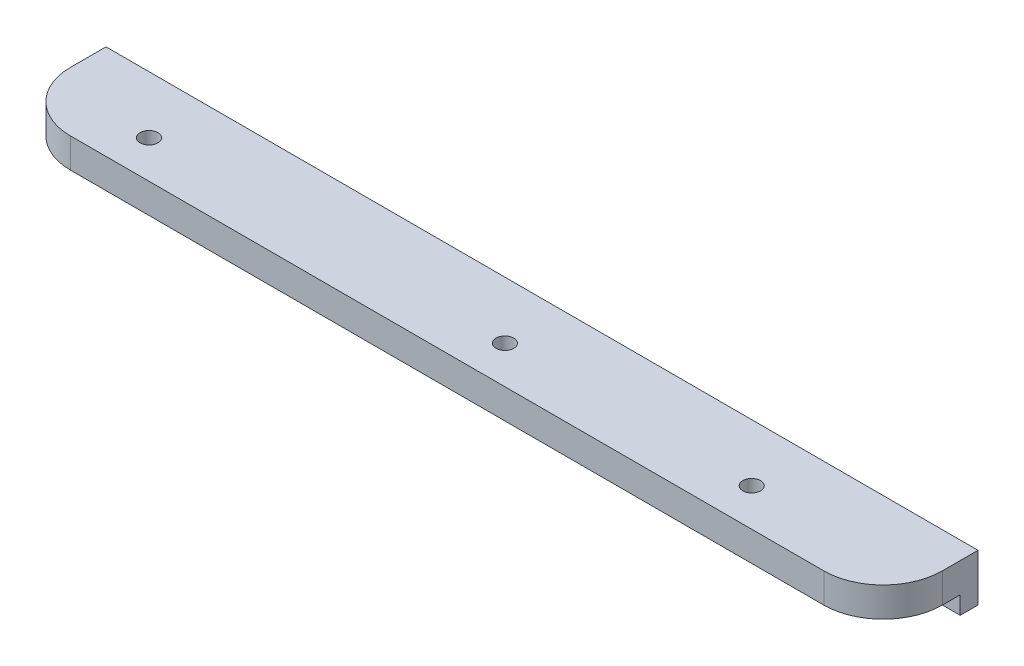
ISO-10303-21;
HEADER;
FILE_DESCRIPTION(('STEP AP214'),'2;1');
FILE_NAME('part.step','',(''),(''),'','','');
FILE_SCHEMA(('AUTOMOTIVE_DESIGN { 1 0 10303 214 1 1 1 1 }'));
ENDSEC;
DATA;
#1=APPLICATION_CONTEXT('core data for automotive mechanical design processes');
#2=APPLICATION_PROTOCOL_DEFINITION('international standard','automotive_design',2000,#1);
#3=PRODUCT_CONTEXT('',#1,'mechanical');
#4=PRODUCT('Part','Part','',(#3));
#5=PRODUCT_RELATED_PRODUCT_CATEGORY('part','',(#4));
#6=PRODUCT_DEFINITION_FORMATION('','',#4);
#7=PRODUCT_DEFINITION_CONTEXT('part definition',#1,'design');
#8=PRODUCT_DEFINITION('design','',#6,#7);
#9=PRODUCT_DEFINITION_SHAPE('','',#8);
#10=(LENGTH_UNIT() NAMED_UNIT(*) SI_UNIT(.MILLI.,.METRE.));
#11=(NAMED_UNIT(*) PLANE_ANGLE_UNIT() SI_UNIT($,.RADIAN.));
#12=(NAMED_UNIT(*) SI_UNIT($,.STERADIAN.) SOLID_ANGLE_UNIT());
#13=UNCERTAINTY_MEASURE_WITH_UNIT(LENGTH_MEASURE(1.E-05),#10,'distance_accuracy_value','');
#14=(GEOMETRIC_REPRESENTATION_CONTEXT(3) GLOBAL_UNCERTAINTY_ASSIGNED_CONTEXT((#13)) GLOBAL_UNIT_ASSIGNED_CONTEXT((#10,
#11,#12)) REPRESENTATION_CONTEXT('',''));
#15=CARTESIAN_POINT('',(0.,0.,0.));
#16=DIRECTION('',(0.,0.,1.));
#17=DIRECTION('',(1.,0.,0.));
#18=AXIS2_PLACEMENT_3D('',#15,#16,#17);
#19=CARTESIAN_POINT('',(-67.1671018276762,5.,0.));
#20=DIRECTION('',(1.,0.,0.));
#21=DIRECTION('',(0.,0.,-1.));
#22=AXIS2_PLACEMENT_3D('',#19,#20,#21);
#23=PLANE('',#22);
#24=DIRECTION('',(0.,0.,1.));
#25=VECTOR('',#24,1.);
#26=CARTESIAN_POINT('',(-67.1671018276762,0.,0.));
#27=LINE('',#26,#25);
#28=CARTESIAN_POINT('',(-67.1671018276762,0.,-27.2297650130548));
#29=VERTEX_POINT('',#28);
#30=CARTESIAN_POINT('',(-67.1671018276762,0.,-21.2297650130548));
#31=VERTEX_POINT('',#30);
#32=EDGE_CURVE('E173',#29,#31,#27,.T.);
#33=ORIENTED_EDGE('',*,*,#32,.F.);
#34=DIRECTION('',(0.,-1.,0.));
#35=VECTOR('',#34,1.);
#36=CARTESIAN_POINT('',(-67.1671018276762,8.,-27.2297650130548));
#37=LINE('',#36,#35);
#38=CARTESIAN_POINT('',(-67.1671018276762,-8.,-27.2297650130548));
#39=VERTEX_POINT('',#38);
#40=EDGE_CURVE('E128',#29,#39,#37,.T.);
#41=ORIENTED_EDGE('',*,*,#40,.T.);
#42=DIRECTION('',(0.,0.,1.));
#43=VECTOR('',#42,1.);
#44=CARTESIAN_POINT('',(-67.1671018276762,-8.,-24.2297650130548));
#45=LINE('',#44,#43);
#46=CARTESIAN_POINT('',(-67.1671018276762,-8.,-24.2297650130548));
#47=VERTEX_POINT('',#46);
#48=EDGE_CURVE('E154',#39,#47,#45,.T.);
#49=ORIENTED_EDGE('',*,*,#48,.T.);
#50=DIRECTION('',(0.,1.,0.));
#51=VECTOR('',#50,1.);
#52=CARTESIAN_POINT('',(-67.1671018276762,-8.,-24.2297650130548));
#53=LINE('',#52,#51);
#54=CARTESIAN_POINT('',(-67.1671018276762,-5.,-24.2297650130548));
#55=VERTEX_POINT('',#54);
#56=EDGE_CURVE('E148',#47,#55,#53,.T.);
#57=ORIENTED_EDGE('',*,*,#56,.T.);
#58=DIRECTION('',(0.,0.,1.));
#59=VECTOR('',#58,1.);
#60=CARTESIAN_POINT('',(-67.1671018276762,-5.,0.));
#61=LINE('',#60,#59);
#62=CARTESIAN_POINT('',(-67.1671018276762,-5.,-21.2297650130548));
#63=VERTEX_POINT('',#62);
#64=EDGE_CURVE('E134',#55,#63,#61,.T.);
#65=ORIENTED_EDGE('',*,*,#64,.T.);
#66=DIRECTION('',(0.,1.,0.));
#67=VECTOR('',#66,1.);
#68=CARTESIAN_POINT('',(-67.1671018276762,0.,-21.2297650130548));
#69=LINE('',#68,#67);
#70=EDGE_CURVE('E107',#63,#31,#69,.T.);
#71=ORIENTED_EDGE('',*,*,#70,.T.);
#72=EDGE_LOOP('',(#33,#41,#49,#57,#65,#71));
#73=FACE_BOUND('',#72,.T.);
#74=ADVANCED_FACE('F35',(#73),#23,.F.);
#75=CARTESIAN_POINT('',(0.,5.,-11.2297650130548));
#76=DIRECTION('',(0.,0.,1.));
#77=DIRECTION('',(1.,0.,0.));
#78=AXIS2_PLACEMENT_3D('',#75,#76,#77);
#79=PLANE('',#78);
#80=DIRECTION('',(0.,1.,0.));
#81=VECTOR('',#80,1.);
#82=CARTESIAN_POINT('',(69.8328981723238,5.,-11.2297650130548));
#83=LINE('',#82,#81);
#84=CARTESIAN_POINT('',(69.8328981723238,-5.,-11.2297650130548));
#85=VERTEX_POINT('',#84);
#86=CARTESIAN_POINT('',(69.8328981723238,0.,-11.2297650130548));
#87=VERTEX_POINT('',#86);
#88=EDGE_CURVE('E115',#85,#87,#83,.T.);
#89=ORIENTED_EDGE('',*,*,#88,.T.);
#90=DIRECTION('',(-1.,0.,0.));
#91=VECTOR('',#90,1.);
#92=CARTESIAN_POINT('',(0.,0.,-11.2297650130548));
#93=LINE('',#92,#91);
#94=CARTESIAN_POINT('',(-57.1671018276763,0.,-11.2297650130548));
#95=VERTEX_POINT('',#94);
#96=EDGE_CURVE('E103',#87,#95,#93,.T.);
#97=ORIENTED_EDGE('',*,*,#96,.T.);
#98=DIRECTION('',(0.,1.,0.));
#99=VECTOR('',#98,1.);
#100=CARTESIAN_POINT('',(-57.1671018276763,-5.,-11.2297650130548));
#101=LINE('',#100,#99);
#102=CARTESIAN_POINT('',(-57.1671018276763,-5.,-11.2297650130548));
#103=VERTEX_POINT('',#102);
#104=EDGE_CURVE('E120',#95,#103,#101,.F.);
#105=ORIENTED_EDGE('',*,*,#104,.T.);
#106=DIRECTION('',(-1.,0.,0.));
#107=VECTOR('',#106,1.);
#108=CARTESIAN_POINT('',(0.,-5.,-11.2297650130548));
#109=LINE('',#108,#107);
#110=EDGE_CURVE('E130',#85,#103,#109,.T.);
#111=ORIENTED_EDGE('',*,*,#110,.F.);
#112=EDGE_LOOP('',(#89,#97,#105,#111));
#113=FACE_BOUND('',#112,.T.);
#114=ADVANCED_FACE('F179',(#113),#79,.T.);
#115=CARTESIAN_POINT('',(79.8328981723237,5.,0.));
#116=DIRECTION('',(1.,0.,0.));
#117=DIRECTION('',(0.,0.,-1.));
#118=AXIS2_PLACEMENT_3D('',#115,#116,#117);
#119=PLANE('',#118);
#120=DIRECTION('',(0.,-1.,0.));
#121=VECTOR('',#120,1.);
#122=CARTESIAN_POINT('',(79.8328981723238,8.,-27.2297650130548));
#123=LINE('',#122,#121);
#124=CARTESIAN_POINT('',(79.8328981723238,0.,-27.2297650130548));
#125=VERTEX_POINT('',#124);
#126=CARTESIAN_POINT('',(79.8328981723238,-8.,-27.2297650130548));
#127=VERTEX_POINT('',#126);
#128=EDGE_CURVE('E113',#125,#127,#123,.T.);
#129=ORIENTED_EDGE('',*,*,#128,.F.);
#130=DIRECTION('',(0.,0.,1.));
#131=VECTOR('',#130,1.);
#132=CARTESIAN_POINT('',(79.8328981723237,0.,0.));
#133=LINE('',#132,#131);
#134=CARTESIAN_POINT('',(79.8328981723238,0.,-21.2297650130548));
#135=VERTEX_POINT('',#134);
#136=EDGE_CURVE('E100',#125,#135,#133,.T.);
#137=ORIENTED_EDGE('',*,*,#136,.T.);
#138=DIRECTION('',(0.,1.,0.));
#139=VECTOR('',#138,1.);
#140=CARTESIAN_POINT('',(79.8328981723238,5.,-21.2297650130548));
#141=LINE('',#140,#139);
#142=CARTESIAN_POINT('',(79.8328981723238,-5.,-21.2297650130548));
#143=VERTEX_POINT('',#142);
#144=EDGE_CURVE('E43',#135,#143,#141,.F.);
#145=ORIENTED_EDGE('',*,*,#144,.T.);
#146=DIRECTION('',(0.,0.,1.));
#147=VECTOR('',#146,1.);
#148=CARTESIAN_POINT('',(79.8328981723237,-5.,0.));
#149=LINE('',#148,#147);
#150=CARTESIAN_POINT('',(79.8328981723238,-5.,-24.2297650130548));
#151=VERTEX_POINT('',#150);
#152=EDGE_CURVE('E132',#151,#143,#149,.T.);
#153=ORIENTED_EDGE('',*,*,#152,.F.);
#154=DIRECTION('',(0.,1.,0.));
#155=VECTOR('',#154,1.);
#156=CARTESIAN_POINT('',(79.8328981723238,-8.,-24.2297650130548));
#157=LINE('',#156,#155);
#158=CARTESIAN_POINT('',(79.8328981723238,-8.,-24.2297650130548));
#159=VERTEX_POINT('',#158);
#160=EDGE_CURVE('E146',#159,#151,#157,.T.);
#161=ORIENTED_EDGE('',*,*,#160,.F.);
#162=DIRECTION('',(0.,0.,-1.));
#163=VECTOR('',#162,1.);
#164=CARTESIAN_POINT('',(79.8328981723238,-8.,-24.2297650130548));
#165=LINE('',#164,#163);
#166=EDGE_CURVE('E158',#159,#127,#165,.T.);
#167=ORIENTED_EDGE('',*,*,#166,.T.);
#168=EDGE_LOOP('',(#129,#137,#145,#153,#161,#167));
#169=FACE_BOUND('',#168,.T.);
#170=ADVANCED_FACE('F111',(#169),#119,.T.);
#171=CARTESIAN_POINT('',(51.3328981723237,5.,-17.5797650130548));
#172=DIRECTION('',(0.,-1.,0.));
#173=DIRECTION('',(0.,0.,-1.));
#174=AXIS2_PLACEMENT_3D('',#171,#172,#173);
#175=CYLINDRICAL_SURFACE('',#174,1.5);
#176=CARTESIAN_POINT('',(51.3328981723237,-5.,-17.5797650130548));
#177=DIRECTION('',(0.,1.,0.));
#178=DIRECTION('',(0.,0.,1.));
#179=AXIS2_PLACEMENT_3D('',#176,#177,#178);
#180=CIRCLE('',#179,1.5);
#181=CARTESIAN_POINT('',(51.3328981723237,-5.,-16.0797650130548));
#182=VERTEX_POINT('',#181);
#183=EDGE_CURVE('E137',#182,#182,#180,.T.);
#184=ORIENTED_EDGE('',*,*,#183,.F.);
#185=EDGE_LOOP('',(#184));
#186=FACE_BOUND('',#185,.T.);
#187=CARTESIAN_POINT('',(51.3328981723237,0.,-17.5797650130548));
#188=DIRECTION('',(0.,1.,0.));
#189=DIRECTION('',(0.,0.,1.));
#190=AXIS2_PLACEMENT_3D('',#187,#188,#189);
#191=CIRCLE('',#190,1.5);
#192=CARTESIAN_POINT('',(51.3328981723237,0.,-16.0797650130548));
#193=VERTEX_POINT('',#192);
#194=EDGE_CURVE('E155',#193,#193,#191,.T.);
#195=ORIENTED_EDGE('',*,*,#194,.T.);
#196=EDGE_LOOP('',(#195));
#197=FACE_BOUND('',#196,.T.);
#198=ADVANCED_FACE('F220',(#186,#197),#175,.F.);
#199=CARTESIAN_POINT('',(9.72289817232375,5.,-17.5797650130548));
#200=DIRECTION('',(0.,-1.,0.));
#201=DIRECTION('',(0.,0.,-1.));
#202=AXIS2_PLACEMENT_3D('',#199,#200,#201);
#203=CYLINDRICAL_SURFACE('',#202,1.5);
#204=CARTESIAN_POINT('',(9.72289817232375,-5.,-17.5797650130548));
#205=DIRECTION('',(0.,1.,0.));
#206=DIRECTION('',(0.,0.,1.));
#207=AXIS2_PLACEMENT_3D('',#204,#205,#206);
#208=CIRCLE('',#207,1.5);
#209=CARTESIAN_POINT('',(9.72289817232375,-5.,-16.0797650130548));
#210=VERTEX_POINT('',#209);
#211=EDGE_CURVE('E140',#210,#210,#208,.T.);
#212=ORIENTED_EDGE('',*,*,#211,.F.);
#213=EDGE_LOOP('',(#212));
#214=FACE_BOUND('',#213,.T.);
#215=CARTESIAN_POINT('',(9.72289817232375,0.,-17.5797650130548));
#216=DIRECTION('',(0.,1.,0.));
#217=DIRECTION('',(0.,0.,1.));
#218=AXIS2_PLACEMENT_3D('',#215,#216,#217);
#219=CIRCLE('',#218,1.5);
#220=CARTESIAN_POINT('',(9.72289817232375,0.,-16.0797650130548));
#221=VERTEX_POINT('',#220);
#222=EDGE_CURVE('E167',#221,#221,#219,.T.);
#223=ORIENTED_EDGE('',*,*,#222,.T.);
#224=EDGE_LOOP('',(#223));
#225=FACE_BOUND('',#224,.T.);
#226=ADVANCED_FACE('F209',(#214,#225),#203,.F.);
#227=CARTESIAN_POINT('',(-50.2671018276763,5.,-17.5797650130548));
#228=DIRECTION('',(0.,-1.,0.));
#229=DIRECTION('',(0.,0.,-1.));
#230=AXIS2_PLACEMENT_3D('',#227,#228,#229);
#231=CYLINDRICAL_SURFACE('',#230,1.5);
#232=CARTESIAN_POINT('',(-50.2671018276763,-5.,-17.5797650130548));
#233=DIRECTION('',(0.,1.,0.));
#234=DIRECTION('',(0.,0.,1.));
#235=AXIS2_PLACEMENT_3D('',#232,#233,#234);
#236=CIRCLE('',#235,1.5);
#237=CARTESIAN_POINT('',(-50.2671018276763,-5.,-16.0797650130548));
#238=VERTEX_POINT('',#237);
#239=EDGE_CURVE('E143',#238,#238,#236,.T.);
#240=ORIENTED_EDGE('',*,*,#239,.F.);
#241=EDGE_LOOP('',(#240));
#242=FACE_BOUND('',#241,.T.);
#243=CARTESIAN_POINT('',(-50.2671018276763,0.,-17.5797650130548));
#244=DIRECTION('',(0.,1.,0.));
#245=DIRECTION('',(0.,0.,1.));
#246=AXIS2_PLACEMENT_3D('',#243,#244,#245);
#247=CIRCLE('',#246,1.5);
#248=CARTESIAN_POINT('',(-50.2671018276763,0.,-16.0797650130548));
#249=VERTEX_POINT('',#248);
#250=EDGE_CURVE('E170',#249,#249,#247,.T.);
#251=ORIENTED_EDGE('',*,*,#250,.T.);
#252=EDGE_LOOP('',(#251));
#253=FACE_BOUND('',#252,.T.);
#254=ADVANCED_FACE('F201',(#242,#253),#231,.F.);
#255=CARTESIAN_POINT('',(-67.1671018276762,8.,-27.2297650130548));
#256=DIRECTION('',(0.,0.,1.));
#257=DIRECTION('',(1.,0.,0.));
#258=AXIS2_PLACEMENT_3D('',#255,#256,#257);
#259=PLANE('',#258);
#260=DIRECTION('',(-1.,0.,0.));
#261=VECTOR('',#260,1.);
#262=CARTESIAN_POINT('',(-67.1671018276762,0.,-27.2297650130548));
#263=LINE('',#262,#261);
#264=EDGE_CURVE('E175',#125,#29,#263,.T.);
#265=ORIENTED_EDGE('',*,*,#264,.F.);
#266=ORIENTED_EDGE('',*,*,#128,.T.);
#267=DIRECTION('',(-1.,0.,0.));
#268=VECTOR('',#267,1.);
#269=CARTESIAN_POINT('',(-67.1671018276762,-8.,-27.2297650130548));
#270=LINE('',#269,#268);
#271=EDGE_CURVE('E160',#127,#39,#270,.T.);
#272=ORIENTED_EDGE('',*,*,#271,.T.);
#273=ORIENTED_EDGE('',*,*,#40,.F.);
#274=EDGE_LOOP('',(#265,#266,#272,#273));
#275=FACE_BOUND('',#274,.T.);
#276=ADVANCED_FACE('F199',(#275),#259,.F.);
#277=CARTESIAN_POINT('',(0.,-5.,0.));
#278=DIRECTION('',(0.,-1.,0.));
#279=DIRECTION('',(0.,0.,1.));
#280=AXIS2_PLACEMENT_3D('',#277,#278,#279);
#281=PLANE('',#280);
#282=ORIENTED_EDGE('',*,*,#239,.T.);
#283=EDGE_LOOP('',(#282));
#284=FACE_BOUND('',#283,.T.);
#285=ORIENTED_EDGE('',*,*,#211,.T.);
#286=EDGE_LOOP('',(#285));
#287=FACE_BOUND('',#286,.T.);
#288=ORIENTED_EDGE('',*,*,#183,.T.);
#289=EDGE_LOOP('',(#288));
#290=FACE_BOUND('',#289,.T.);
#291=ORIENTED_EDGE('',*,*,#152,.T.);
#292=CARTESIAN_POINT('',(69.8328981723238,-5.,-21.2297650130548));
#293=DIRECTION('',(0.,-1.,0.));
#294=DIRECTION('',(0.,0.,-1.));
#295=AXIS2_PLACEMENT_3D('',#292,#293,#294);
#296=CIRCLE('',#295,10.);
#297=EDGE_CURVE('E11',#143,#85,#296,.T.);
#298=ORIENTED_EDGE('',*,*,#297,.T.);
#299=ORIENTED_EDGE('',*,*,#110,.T.);
#300=CARTESIAN_POINT('',(-57.1671018276763,-5.,-21.2297650130548));
#301=DIRECTION('',(0.,-1.,0.));
#302=DIRECTION('',(0.,0.,-1.));
#303=AXIS2_PLACEMENT_3D('',#300,#301,#302);
#304=CIRCLE('',#303,10.);
#305=EDGE_CURVE('E116',#103,#63,#304,.T.);
#306=ORIENTED_EDGE('',*,*,#305,.T.);
#307=ORIENTED_EDGE('',*,*,#64,.F.);
#308=DIRECTION('',(1.,0.,0.));
#309=VECTOR('',#308,1.);
#310=CARTESIAN_POINT('',(-67.1671018276762,-5.,-24.2297650130548));
#311=LINE('',#310,#309);
#312=EDGE_CURVE('E151',#55,#151,#311,.T.);
#313=ORIENTED_EDGE('',*,*,#312,.T.);
#314=EDGE_LOOP('',(#291,#298,#299,#306,#307,#313));
#315=FACE_BOUND('',#314,.T.);
#316=ADVANCED_FACE('F185',(#284,#287,#290,#315),#281,.T.);
#317=CARTESIAN_POINT('',(-67.1671018276762,-8.,-24.2297650130548));
#318=DIRECTION('',(0.,0.,1.));
#319=DIRECTION('',(1.,0.,0.));
#320=AXIS2_PLACEMENT_3D('',#317,#318,#319);
#321=PLANE('',#320);
#322=ORIENTED_EDGE('',*,*,#312,.F.);
#323=ORIENTED_EDGE('',*,*,#56,.F.);
#324=DIRECTION('',(1.,0.,0.));
#325=VECTOR('',#324,1.);
#326=CARTESIAN_POINT('',(-67.1671018276762,-8.,-24.2297650130548));
#327=LINE('',#326,#325);
#328=EDGE_CURVE('E150',#47,#159,#327,.T.);
#329=ORIENTED_EDGE('',*,*,#328,.T.);
#330=ORIENTED_EDGE('',*,*,#160,.T.);
#331=EDGE_LOOP('',(#322,#323,#329,#330));
#332=FACE_BOUND('',#331,.T.);
#333=ADVANCED_FACE('F192',(#332),#321,.T.);
#334=CARTESIAN_POINT('',(0.,-8.,0.));
#335=DIRECTION('',(0.,1.,0.));
#336=DIRECTION('',(0.,0.,-1.));
#337=AXIS2_PLACEMENT_3D('',#334,#335,#336);
#338=PLANE('',#337);
#339=ORIENTED_EDGE('',*,*,#48,.F.);
#340=ORIENTED_EDGE('',*,*,#271,.F.);
#341=ORIENTED_EDGE('',*,*,#166,.F.);
#342=ORIENTED_EDGE('',*,*,#328,.F.);
#343=EDGE_LOOP('',(#339,#340,#341,#342));
#344=FACE_BOUND('',#343,.T.);
#345=ADVANCED_FACE('F196',(#344),#338,.F.);
#346=CARTESIAN_POINT('',(-57.1671018276763,5.,-21.2297650130548));
#347=DIRECTION('',(0.,-1.,0.));
#348=DIRECTION('',(0.,0.,-1.));
#349=AXIS2_PLACEMENT_3D('',#346,#347,#348);
#350=CYLINDRICAL_SURFACE('',#349,10.);
#351=ORIENTED_EDGE('',*,*,#305,.F.);
#352=ORIENTED_EDGE('',*,*,#104,.F.);
#353=CARTESIAN_POINT('',(-57.1671018276763,0.,-21.2297650130548));
#354=DIRECTION('',(0.,1.,0.));
#355=DIRECTION('',(0.,0.,1.));
#356=AXIS2_PLACEMENT_3D('',#353,#354,#355);
#357=CIRCLE('',#356,10.);
#358=EDGE_CURVE('E108',#95,#31,#357,.F.);
#359=ORIENTED_EDGE('',*,*,#358,.T.);
#360=ORIENTED_EDGE('',*,*,#70,.F.);
#361=EDGE_LOOP('',(#351,#352,#359,#360));
#362=FACE_BOUND('',#361,.T.);
#363=ADVANCED_FACE('F182',(#362),#350,.T.);
#364=CARTESIAN_POINT('',(69.8328981723238,5.,-21.2297650130548));
#365=DIRECTION('',(0.,1.,0.));
#366=DIRECTION('',(0.,0.,1.));
#367=AXIS2_PLACEMENT_3D('',#364,#365,#366);
#368=CYLINDRICAL_SURFACE('',#367,10.);
#369=ORIENTED_EDGE('',*,*,#297,.F.);
#370=ORIENTED_EDGE('',*,*,#144,.F.);
#371=CARTESIAN_POINT('',(69.8328981723238,0.,-21.2297650130548));
#372=DIRECTION('',(0.,1.,0.));
#373=DIRECTION('',(0.,0.,1.));
#374=AXIS2_PLACEMENT_3D('',#371,#372,#373);
#375=CIRCLE('',#374,10.);
#376=EDGE_CURVE('E98',#135,#87,#375,.F.);
#377=ORIENTED_EDGE('',*,*,#376,.T.);
#378=ORIENTED_EDGE('',*,*,#88,.F.);
#379=EDGE_LOOP('',(#369,#370,#377,#378));
#380=FACE_BOUND('',#379,.T.);
#381=ADVANCED_FACE('F37',(#380),#368,.T.);
#382=CARTESIAN_POINT('',(0.,0.,0.));
#383=DIRECTION('',(0.,1.,0.));
#384=DIRECTION('',(0.,0.,1.));
#385=AXIS2_PLACEMENT_3D('',#382,#383,#384);
#386=PLANE('',#385);
#387=ORIENTED_EDGE('',*,*,#194,.F.);
#388=EDGE_LOOP('',(#387));
#389=FACE_BOUND('',#388,.T.);
#390=ORIENTED_EDGE('',*,*,#222,.F.);
#391=EDGE_LOOP('',(#390));
#392=FACE_BOUND('',#391,.T.);
#393=ORIENTED_EDGE('',*,*,#250,.F.);
#394=EDGE_LOOP('',(#393));
#395=FACE_BOUND('',#394,.T.);
#396=ORIENTED_EDGE('',*,*,#32,.T.);
#397=ORIENTED_EDGE('',*,*,#358,.F.);
#398=ORIENTED_EDGE('',*,*,#96,.F.);
#399=ORIENTED_EDGE('',*,*,#376,.F.);
#400=ORIENTED_EDGE('',*,*,#136,.F.);
#401=ORIENTED_EDGE('',*,*,#264,.T.);
#402=EDGE_LOOP('',(#396,#397,#398,#399,#400,#401));
#403=FACE_BOUND('',#402,.T.);
#404=ADVANCED_FACE('F99',(#389,#392,#395,#403),#386,.T.);
#405=CLOSED_SHELL('',(#74,#114,#170,#198,#226,#254,#276,#316,#333,#345,#363,#381,#404));
#406=MANIFOLD_SOLID_BREP('B2',#405);
#407=ADVANCED_BREP_SHAPE_REPRESENTATION('',(#18,#406),#14);
#408=SHAPE_DEFINITION_REPRESENTATION(#9,#407);
ENDSEC;
END-ISO-10303-21;
